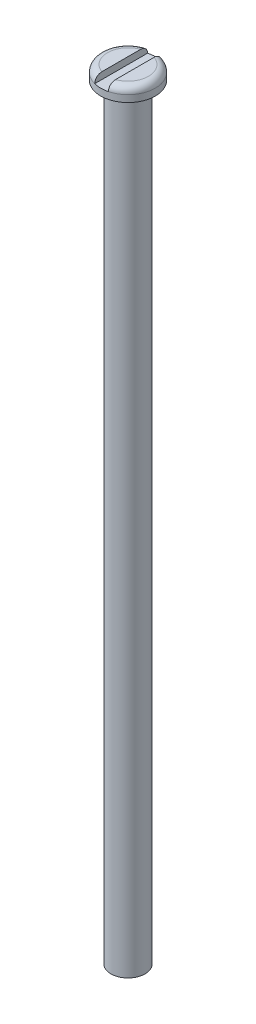
ISO-10303-21;
HEADER;
FILE_DESCRIPTION(('STEP AP214'),'2;1');
FILE_NAME('part.step','',(''),(''),'','','');
FILE_SCHEMA(('AUTOMOTIVE_DESIGN { 1 0 10303 214 1 1 1 1 }'));
ENDSEC;
DATA;
#1=APPLICATION_CONTEXT('core data for automotive mechanical design processes');
#2=APPLICATION_PROTOCOL_DEFINITION('international standard','automotive_design',2000,#1);
#3=PRODUCT_CONTEXT('',#1,'mechanical');
#4=PRODUCT('Part','Part','',(#3));
#5=PRODUCT_RELATED_PRODUCT_CATEGORY('part','',(#4));
#6=PRODUCT_DEFINITION_FORMATION('','',#4);
#7=PRODUCT_DEFINITION_CONTEXT('part definition',#1,'design');
#8=PRODUCT_DEFINITION('design','',#6,#7);
#9=PRODUCT_DEFINITION_SHAPE('','',#8);
#10=(LENGTH_UNIT() NAMED_UNIT(*) SI_UNIT(.MILLI.,.METRE.));
#11=(NAMED_UNIT(*) PLANE_ANGLE_UNIT() SI_UNIT($,.RADIAN.));
#12=(NAMED_UNIT(*) SI_UNIT($,.STERADIAN.) SOLID_ANGLE_UNIT());
#13=UNCERTAINTY_MEASURE_WITH_UNIT(LENGTH_MEASURE(1.E-05),#10,'distance_accuracy_value','');
#14=(GEOMETRIC_REPRESENTATION_CONTEXT(3) GLOBAL_UNCERTAINTY_ASSIGNED_CONTEXT((#13)) GLOBAL_UNIT_ASSIGNED_CONTEXT((#10,
#11,#12)) REPRESENTATION_CONTEXT('',''));
#15=CARTESIAN_POINT('',(0.,0.,0.));
#16=DIRECTION('',(0.,0.,1.));
#17=DIRECTION('',(1.,0.,0.));
#18=AXIS2_PLACEMENT_3D('',#15,#16,#17);
#19=CARTESIAN_POINT('',(0.,28.,0.));
#20=DIRECTION('',(0.,-1.,0.));
#21=DIRECTION('',(1.,0.,0.));
#22=AXIS2_PLACEMENT_3D('',#19,#20,#21);
#23=TOROIDAL_SURFACE('',#22,1.5,0.5);
#24=CARTESIAN_POINT('',(0.499999999999995,28.1372310223406,-1.91665451947094));
#25=CARTESIAN_POINT('',(0.499999999999995,28.1111030287091,-1.92436032075733));
#26=CARTESIAN_POINT('',(0.499999999999995,28.0843073274934,-1.92987362814176));
#27=CARTESIAN_POINT('',(0.499999999999995,28.0301483567895,-1.93632218137685));
#28=CARTESIAN_POINT('',(0.499999999999995,28.0027844659836,-1.93725211838577));
#29=CARTESIAN_POINT('',(0.499999999999995,27.9483010541632,-1.93449492886738));
#30=CARTESIAN_POINT('',(0.499999999999995,27.9211814237109,-1.93080998543376));
#31=CARTESIAN_POINT('',(0.499999999999995,27.8679522289656,-1.91894647377858));
#32=CARTESIAN_POINT('',(0.499999999999995,27.8418424337837,-1.91076893932324));
#33=CARTESIAN_POINT('',(0.499999999999995,27.7913041955103,-1.89016400943665));
#34=CARTESIAN_POINT('',(0.499999999999995,27.7668788857467,-1.8777289377535));
#35=CARTESIAN_POINT('',(0.499999999999995,27.7204150273195,-1.84900121197603));
#36=CARTESIAN_POINT('',(0.499999999999995,27.6983766855855,-1.83270822382299));
#37=CARTESIAN_POINT('',(0.499999999999995,27.6568847412822,-1.79644210983312));
#38=CARTESIAN_POINT('',(0.499999999999995,27.637483085636,-1.77640960398661));
#39=CARTESIAN_POINT('',(0.499999999999995,27.6021946414116,-1.73346022322838));
#40=CARTESIAN_POINT('',(0.499999999999995,27.5863082901203,-1.71054299002609));
#41=CARTESIAN_POINT('',(0.499999999999995,27.5579418179236,-1.66170188568055));
#42=CARTESIAN_POINT('',(0.499999999999995,27.5455871921618,-1.6357051900118));
#43=CARTESIAN_POINT('',(0.499999999999995,27.5252135651284,-1.58206792581925));
#44=CARTESIAN_POINT('',(0.499999999999995,27.5171953670182,-1.55442705382473));
#45=CARTESIAN_POINT('',(0.499999999999995,27.5053415150427,-1.49700293927695));
#46=CARTESIAN_POINT('',(0.499999999999995,27.501703890573,-1.46717885726814));
#47=CARTESIAN_POINT('',(0.499999999999995,27.4992421992746,-1.40733409548799));
#48=CARTESIAN_POINT('',(0.499999999999995,27.5004192819155,-1.37731337047799));
#49=CARTESIAN_POINT('',(0.499999999999995,27.5076329208896,-1.31640425916088));
#50=CARTESIAN_POINT('',(0.499999999999995,27.5138991078074,-1.28554300688512));
#51=CARTESIAN_POINT('',(0.499999999999995,27.5313488547117,-1.22523984294278));
#52=CARTESIAN_POINT('',(0.499999999999995,27.5425337056629,-1.19579830615081));
#53=CARTESIAN_POINT('',(0.499999999999995,27.5699767607518,-1.13816612578737));
#54=CARTESIAN_POINT('',(0.499999999999995,27.586391484798,-1.11004976955907));
#55=CARTESIAN_POINT('',(0.499999999999995,27.6237865493616,-1.05701373167176));
#56=CARTESIAN_POINT('',(0.499999999999995,27.644768083297,-1.03209488831107));
#57=CARTESIAN_POINT('',(0.499999999999995,27.6904370031974,-0.98678879896332));
#58=CARTESIAN_POINT('',(0.499999999999995,27.7150519547229,-0.966328931187963));
#59=CARTESIAN_POINT('',(0.499999999999995,27.767681679186,-0.930375773200786));
#60=CARTESIAN_POINT('',(0.499999999999995,27.7956932937045,-0.914877917106744));
#61=CARTESIAN_POINT('',(0.499999999999995,27.8513383681017,-0.891106681560979));
#62=CARTESIAN_POINT('',(0.499999999999995,27.8787277312908,-0.882264419340739));
#63=CARTESIAN_POINT('',(0.499999999999995,27.9346903948718,-0.87003427323492));
#64=CARTESIAN_POINT('',(0.499999999999995,27.9632623188285,-0.866640221434832));
#65=CARTESIAN_POINT('',(0.499999999999995,28.0170120562944,-0.865628474257113));
#66=CARTESIAN_POINT('',(0.499999999999995,28.0421796884719,-0.867357969378075));
#67=CARTESIAN_POINT('',(0.499999999999995,28.0918437182699,-0.875102569275719));
#68=CARTESIAN_POINT('',(0.499999999999995,28.116340099567,-0.881117778176436));
#69=CARTESIAN_POINT('',(0.499999999999995,28.1635991621832,-0.896950674656478));
#70=CARTESIAN_POINT('',(0.499999999999995,28.1863840384943,-0.906702858939272));
#71=CARTESIAN_POINT('',(0.499999999999995,28.2301969986554,-0.929562024296266));
#72=CARTESIAN_POINT('',(0.499999999999995,28.2512245651975,-0.942669988646086));
#73=CARTESIAN_POINT('',(0.499999999999995,28.2931106809172,-0.973179496401465));
#74=CARTESIAN_POINT('',(0.499999999999995,28.3137554609807,-0.990873988568376));
#75=CARTESIAN_POINT('',(0.499999999999995,28.3521765474984,-1.02914084315259));
#76=CARTESIAN_POINT('',(0.499999999999995,28.3699514599456,-1.04971459513559));
#77=CARTESIAN_POINT('',(0.499999999999995,28.4042835961954,-1.0957780233886));
#78=CARTESIAN_POINT('',(0.499999999999995,28.4204478269707,-1.12156132770368));
#79=CARTESIAN_POINT('',(0.499999999999995,28.4485319642397,-1.17534717522243));
#80=CARTESIAN_POINT('',(0.499999999999995,28.4604502990541,-1.20335053553219));
#81=CARTESIAN_POINT('',(0.499999999999995,28.4803883223137,-1.26275314354975));
#82=CARTESIAN_POINT('',(0.499999999999995,28.4881047229037,-1.29425483103533));
#83=CARTESIAN_POINT('',(0.499999999999995,28.4981246276801,-1.35811227879582));
#84=CARTESIAN_POINT('',(0.499999999999995,28.5004278642675,-1.39046808121382));
#85=CARTESIAN_POINT('',(0.499999999999995,28.4994431079835,-1.45499178732174));
#86=CARTESIAN_POINT('',(0.499999999999995,28.4961740875084,-1.4871599558984));
#87=CARTESIAN_POINT('',(0.499999999999995,28.4840368750671,-1.55042474589614));
#88=CARTESIAN_POINT('',(0.499999999999995,28.4751701154575,-1.58152163929046));
#89=CARTESIAN_POINT('',(0.499999999999995,28.4524692816474,-1.64033547604312));
#90=CARTESIAN_POINT('',(0.499999999999995,28.4388619288739,-1.66813984619569));
#91=CARTESIAN_POINT('',(0.499999999999995,28.4069342614986,-1.72091100337039));
#92=CARTESIAN_POINT('',(0.499999999999995,28.388613986008,-1.74587781393809));
#93=CARTESIAN_POINT('',(0.499999999999995,28.3487614820012,-1.79095515965259));
#94=CARTESIAN_POINT('',(0.499999999999995,28.327429849662,-1.81124333251702));
#95=CARTESIAN_POINT('',(0.499999999999995,28.2815592458641,-1.84774612883821));
#96=CARTESIAN_POINT('',(0.499999999999995,28.2570255373608,-1.86396731175743));
#97=CARTESIAN_POINT('',(0.499999999999995,28.2163211101127,-1.88594608635924));
#98=CARTESIAN_POINT('',(0.499999999999995,28.200959771928,-1.89323849355055));
#99=CARTESIAN_POINT('',(0.499999999999995,28.1695625322402,-1.90618970494275));
#100=CARTESIAN_POINT('',(0.499999999999995,28.1535266404202,-1.91184853258454));
#101=CARTESIAN_POINT('',(0.499999999999995,28.1372310223406,-1.91665451947094));
#102=B_SPLINE_CURVE_WITH_KNOTS('',3,(#24,#25,#26,#27,#28,#29,#30,#31,#32,#33,#34,#35,#36,#37,
#38,#39,#40,#41,#42,#43,#44,#45,#46,#47,#48,#49,#50,#51,#52,#53,#54,#55,#56,#57,#58,#59,#60,#61,
#62,#63,#64,#65,#66,#67,#68,#69,#70,#71,#72,#73,#74,#75,#76,#77,#78,#79,#80,#81,#82,#83,#84,#85,
#86,#87,#88,#89,#90,#91,#92,#93,#94,#95,#96,#97,#98,#99,#100,#101),.UNSPECIFIED.,.T.,.F.,(4,2,2,
2,2,2,2,2,2,2,2,2,2,2,2,2,2,2,2,2,2,2,2,2,2,2,2,2,2,2,2,2,2,2,2,2,2,2,4),(0.,0.0816598146833397,
0.163414192381001,0.245129910340836,0.326826833002296,0.408671836047236,0.490523928681237,
0.573807573052523,0.657101571692336,0.743065274013785,0.829044892453392,0.918780762726308,
1.00853805791329,1.10258645496875,1.19665955094276,1.2938648467062,1.3910955751315,
1.48659947353523,1.58201523808833,1.66785668359786,1.75360087936532,1.82890834620228,
1.90421764274255,1.97826317384213,2.052330425871,2.13357393390031,2.21485678711894,
2.30575813710544,2.39669310065417,2.49353083807835,2.59037336256196,2.68688681627475,
2.78337558400844,2.87577041095961,2.96816447117905,3.05604555840148,3.14378398099421,
3.19471465203011,3.2456445922048),.UNSPECIFIED.);
#103=CARTESIAN_POINT('',(0.499999999999995,28.5,-1.4142135623731));
#104=VERTEX_POINT('',#103);
#105=CARTESIAN_POINT('',(0.499999999999995,28.,-1.93649167310371));
#106=VERTEX_POINT('',#105);
#107=EDGE_CURVE('E88',#104,#106,#102,.T.);
#108=ORIENTED_EDGE('',*,*,#107,.F.);
#109=CARTESIAN_POINT('',(0.,28.5,0.));
#110=DIRECTION('',(0.,-1.,0.));
#111=DIRECTION('',(1.,0.,0.));
#112=AXIS2_PLACEMENT_3D('',#109,#110,#111);
#113=CIRCLE('',#112,1.5);
#114=CARTESIAN_POINT('',(0.499999999999995,28.5,1.4142135623731));
#115=VERTEX_POINT('',#114);
#116=EDGE_CURVE('E94',#104,#115,#113,.T.);
#117=ORIENTED_EDGE('',*,*,#116,.T.);
#118=CARTESIAN_POINT('',(0.499999999999995,28.1224919896329,0.883575136613813));
#119=CARTESIAN_POINT('',(0.499999999999995,28.0987303931295,0.876677411064469));
#120=CARTESIAN_POINT('',(0.499999999999995,28.0743898987017,0.871735096427479));
#121=CARTESIAN_POINT('',(0.499999999999995,28.0252153959676,0.866055634327228));
#122=CARTESIAN_POINT('',(0.499999999999995,28.0003812863677,0.865319359106039));
#123=CARTESIAN_POINT('',(0.499999999999995,27.9509628547997,0.868098938224834));
#124=CARTESIAN_POINT('',(0.499999999999995,27.926378448902,0.871613312709289));
#125=CARTESIAN_POINT('',(0.499999999999995,27.878140141063,0.882679301416792));
#126=CARTESIAN_POINT('',(0.499999999999995,27.8544864564044,0.890231852443535));
#127=CARTESIAN_POINT('',(0.499999999999995,27.8084170492379,0.909086115754863));
#128=CARTESIAN_POINT('',(0.499999999999995,27.7860187266466,0.920430015077866));
#129=CARTESIAN_POINT('',(0.499999999999995,27.7431890921763,0.946355961560683));
#130=CARTESIAN_POINT('',(0.499999999999995,27.7227584257207,0.9609390660815));
#131=CARTESIAN_POINT('',(0.499999999999995,27.6820675772419,0.994609103590451));
#132=CARTESIAN_POINT('',(0.499999999999995,27.6620709590821,1.01401433013659));
#133=CARTESIAN_POINT('',(0.499999999999995,27.6252136261326,1.05560324616767));
#134=CARTESIAN_POINT('',(0.499999999999995,27.6083544493222,1.07778828945429));
#135=CARTESIAN_POINT('',(0.499999999999995,27.576346273635,1.12698254192573));
#136=CARTESIAN_POINT('',(0.499999999999995,27.5615987572825,1.1542538075449));
#137=CARTESIAN_POINT('',(0.499999999999995,27.5366343353669,1.21080018030676));
#138=CARTESIAN_POINT('',(0.499999999999995,27.5264188406612,1.24007590818634));
#139=CARTESIAN_POINT('',(0.499999999999995,27.5104057072038,1.30138641194105));
#140=CARTESIAN_POINT('',(0.499999999999995,27.5048541877588,1.33348596047433));
#141=CARTESIAN_POINT('',(0.499999999999995,27.4993005343658,1.39816622305223));
#142=CARTESIAN_POINT('',(0.499999999999995,27.4992982968328,1.43074692810406));
#143=CARTESIAN_POINT('',(0.499999999999995,27.5049310314524,1.49494778264042));
#144=CARTESIAN_POINT('',(0.499999999999995,27.510484301934,1.52657500998176));
#145=CARTESIAN_POINT('',(0.499999999999995,27.527081424127,1.58835819478915));
#146=CARTESIAN_POINT('',(0.499999999999995,27.5381239311782,1.61851451058851));
#147=CARTESIAN_POINT('',(0.499999999999995,27.5648535477049,1.67500567270412));
#148=CARTESIAN_POINT('',(0.499999999999995,27.5803040327565,1.70145242295631));
#149=CARTESIAN_POINT('',(0.499999999999995,27.6156386681566,1.75119913021605));
#150=CARTESIAN_POINT('',(0.499999999999995,27.6355215377573,1.7744999931185));
#151=CARTESIAN_POINT('',(0.499999999999995,27.6781100681977,1.81610346713436));
#152=CARTESIAN_POINT('',(0.499999999999995,27.7006332268706,1.83459300610749));
#153=CARTESIAN_POINT('',(0.499999999999995,27.7485626639963,1.86735541861617));
#154=CARTESIAN_POINT('',(0.499999999999995,27.7739682800905,1.88162925816993));
#155=CARTESIAN_POINT('',(0.499999999999995,27.8259278974374,1.90502369229291));
#156=CARTESIAN_POINT('',(0.499999999999995,27.8524054297903,1.91431432811617));
#157=CARTESIAN_POINT('',(0.499999999999995,27.9065620897995,1.928211617263));
#158=CARTESIAN_POINT('',(0.499999999999995,27.9342410481127,1.93281892848871));
#159=CARTESIAN_POINT('',(0.499999999999995,27.9893935488854,1.9371486498561));
#160=CARTESIAN_POINT('',(0.499999999999995,28.0168592756722,1.93697123268119));
#161=CARTESIAN_POINT('',(0.499999999999995,28.0713657582182,1.9319846674338));
#162=CARTESIAN_POINT('',(0.499999999999995,28.0984065362462,1.92717576289613));
#163=CARTESIAN_POINT('',(0.499999999999995,28.1511761532345,1.91311452262224));
#164=CARTESIAN_POINT('',(0.499999999999995,28.1769102804398,1.90388199506377));
#165=CARTESIAN_POINT('',(0.499999999999995,28.2264879507849,1.88127546140193));
#166=CARTESIAN_POINT('',(0.499999999999995,28.2503314402032,1.86790133767024));
#167=CARTESIAN_POINT('',(0.499999999999995,28.2957627294643,1.83724702398013));
#168=CARTESIAN_POINT('',(0.499999999999995,28.3173210610862,1.81992320319197));
#169=CARTESIAN_POINT('',(0.499999999999995,28.3573158037485,1.78198792739617));
#170=CARTESIAN_POINT('',(0.499999999999995,28.3757519069765,1.76137614862573));
#171=CARTESIAN_POINT('',(0.499999999999995,28.4095226302009,1.71687531577245));
#172=CARTESIAN_POINT('',(0.499999999999995,28.4247610587677,1.69291332520379));
#173=CARTESIAN_POINT('',(0.499999999999995,28.4511743480846,1.64284859312565));
#174=CARTESIAN_POINT('',(0.499999999999995,28.4623485316293,1.61674549574107));
#175=CARTESIAN_POINT('',(0.499999999999995,28.4808026562962,1.56203754007973));
#176=CARTESIAN_POINT('',(0.499999999999995,28.4879098141742,1.53337445192267));
#177=CARTESIAN_POINT('',(0.499999999999995,28.4974492851418,1.47528274033668));
#178=CARTESIAN_POINT('',(0.499999999999995,28.4998805578692,1.44585394801811));
#179=CARTESIAN_POINT('',(0.499999999999995,28.5001163052263,1.38557476617824));
#180=CARTESIAN_POINT('',(0.499999999999995,28.4976947003189,1.35472348258262));
#181=CARTESIAN_POINT('',(0.499999999999995,28.4879266519966,1.29381121958623));
#182=CARTESIAN_POINT('',(0.499999999999995,28.4805791763709,1.26375040720021));
#183=CARTESIAN_POINT('',(0.499999999999995,28.4607895541768,1.2039482632493));
#184=CARTESIAN_POINT('',(0.499999999999995,28.4481467112772,1.174273174727));
#185=CARTESIAN_POINT('',(0.499999999999995,28.4180921574932,1.11741827653465));
#186=CARTESIAN_POINT('',(0.499999999999995,28.4006775830868,1.09023997831015));
#187=CARTESIAN_POINT('',(0.499999999999995,28.3613199611298,1.03905099791998));
#188=CARTESIAN_POINT('',(0.499999999999995,28.3393440614349,1.01506549123719));
#189=CARTESIAN_POINT('',(0.499999999999995,28.2914341482557,0.971474154978753));
#190=CARTESIAN_POINT('',(0.499999999999995,28.2655074849609,0.95186035559061));
#191=CARTESIAN_POINT('',(0.499999999999995,28.2199332574621,0.923893510702201));
#192=CARTESIAN_POINT('',(0.499999999999995,28.2012229879933,0.913993528580006));
#193=CARTESIAN_POINT('',(0.499999999999995,28.1626462238625,0.896779481182967));
#194=CARTESIAN_POINT('',(0.499999999999995,28.1427801175615,0.889464553107431));
#195=CARTESIAN_POINT('',(0.499999999999995,28.1224919896329,0.883575136613813));
#196=B_SPLINE_CURVE_WITH_KNOTS('',3,(#118,#119,#120,#121,#122,#123,#124,#125,#126,#127,#128,
#129,#130,#131,#132,#133,#134,#135,#136,#137,#138,#139,#140,#141,#142,#143,#144,#145,#146,#147,
#148,#149,#150,#151,#152,#153,#154,#155,#156,#157,#158,#159,#160,#161,#162,#163,#164,#165,#166,
#167,#168,#169,#170,#171,#172,#173,#174,#175,#176,#177,#178,#179,#180,#181,#182,#183,#184,#185,
#186,#187,#188,#189,#190,#191,#192,#193,#194,#195),.UNSPECIFIED.,.T.,.F.,(4,2,2,2,2,2,2,2,2,2,2,
2,2,2,2,2,2,2,2,2,2,2,2,2,2,2,2,2,2,2,2,2,2,2,2,2,2,2,4),(0.,0.074154278020796,
0.148323933485177,0.222467774357524,0.296628823090705,0.371644186419793,0.446684072798841,
0.529939647604048,0.61323592755174,0.705838007329161,0.798468894736995,0.895726008828229,
0.99298130747973,1.08882704952962,1.18464932447517,1.27607043239229,1.3674651581301,
1.45444981991424,1.54141453386282,1.62518462492976,1.70894294654954,1.790949098956,
1.87295093951597,1.95458897445377,2.03622932826216,2.11881943694544,2.20141768324187,
2.2862261311035,2.37104870372143,2.45924884670791,2.54746861153787,2.6398937249925,
2.73233821208656,2.82865878420412,2.9250372854895,3.02213564834763,3.11905552190526,
3.18239109177394,3.24570550243348),.UNSPECIFIED.);
#197=CARTESIAN_POINT('',(0.499999999999995,28.,1.93649167310371));
#198=VERTEX_POINT('',#197);
#199=EDGE_CURVE('E87',#198,#115,#196,.T.);
#200=ORIENTED_EDGE('',*,*,#199,.F.);
#201=CARTESIAN_POINT('',(0.,28.,0.));
#202=DIRECTION('',(0.,-1.,0.));
#203=DIRECTION('',(1.,0.,0.));
#204=AXIS2_PLACEMENT_3D('',#201,#202,#203);
#205=CIRCLE('',#204,2.);
#206=EDGE_CURVE('E84',#106,#198,#205,.T.);
#207=ORIENTED_EDGE('',*,*,#206,.F.);
#208=EDGE_LOOP('',(#108,#117,#200,#207));
#209=FACE_BOUND('',#208,.T.);
#210=ADVANCED_FACE('F34',(#209),#23,.T.);
#211=CARTESIAN_POINT('',(1.5,28.5,0.));
#212=DIRECTION('',(0.,1.,0.));
#213=DIRECTION('',(-1.,0.,0.));
#214=AXIS2_PLACEMENT_3D('',#211,#212,#213);
#215=PLANE('',#214);
#216=DIRECTION('',(0.,0.,-1.));
#217=VECTOR('',#216,1.);
#218=CARTESIAN_POINT('',(0.499999999999995,28.5,0.));
#219=LINE('',#218,#217);
#220=EDGE_CURVE('E11',#115,#104,#219,.T.);
#221=ORIENTED_EDGE('',*,*,#220,.F.);
#222=ORIENTED_EDGE('',*,*,#116,.F.);
#223=EDGE_LOOP('',(#221,#222));
#224=FACE_BOUND('',#223,.T.);
#225=ADVANCED_FACE('F128',(#224),#215,.T.);
#226=CARTESIAN_POINT('',(-0.500000000000005,28.1372310223406,-1.91665451947094));
#227=CARTESIAN_POINT('',(-0.500000000000005,28.1639075186201,-1.90878408799303));
#228=CARTESIAN_POINT('',(-0.500000000000005,28.1899315138432,-1.89861468774866));
#229=CARTESIAN_POINT('',(-0.500000000000005,28.2399061948691,-1.87400728656625));
#230=CARTESIAN_POINT('',(-0.500000000000005,28.2638537077936,-1.85956289701931));
#231=CARTESIAN_POINT('',(-0.500000000000005,28.3089589350289,-1.82689931747279));
#232=CARTESIAN_POINT('',(-0.500000000000005,28.3301210948364,-1.80868626487721));
#233=CARTESIAN_POINT('',(-0.500000000000005,28.3691553389772,-1.76903935873199));
#234=CARTESIAN_POINT('',(-0.500000000000005,28.3870282704339,-1.74760633705842));
#235=CARTESIAN_POINT('',(-0.500000000000005,28.419421626422,-1.7016624423007));
#236=CARTESIAN_POINT('',(-0.500000000000005,28.4338634721782,-1.67709623033583));
#237=CARTESIAN_POINT('',(-0.500000000000005,28.4586031219643,-1.62596058160794));
#238=CARTESIAN_POINT('',(-0.500000000000005,28.4689000562135,-1.59939072578172));
#239=CARTESIAN_POINT('',(-0.500000000000005,28.4855186582935,-1.54384398988716));
#240=CARTESIAN_POINT('',(-0.500000000000005,28.4916594962777,-1.51481306075414));
#241=CARTESIAN_POINT('',(-0.500000000000005,28.4992215852724,-1.45614479158434));
#242=CARTESIAN_POINT('',(-0.500000000000005,28.5006417577134,-1.42650731452065));
#243=CARTESIAN_POINT('',(-0.500000000000005,28.498785005953,-1.36595813864672));
#244=CARTESIAN_POINT('',(-0.500000000000005,28.4952797943379,-1.33505341745399));
#245=CARTESIAN_POINT('',(-0.500000000000005,28.4833406907206,-1.27421002770104));
#246=CARTESIAN_POINT('',(-0.500000000000005,28.4749055906657,-1.24427159782541));
#247=CARTESIAN_POINT('',(-0.500000000000005,28.4529285133586,-1.1849578758062));
#248=CARTESIAN_POINT('',(-0.500000000000005,28.4391955580386,-1.15565314364886));
#249=CARTESIAN_POINT('',(-0.500000000000005,28.4070116707679,-1.09974253324702));
#250=CARTESIAN_POINT('',(-0.500000000000005,28.3885592258725,-1.07313752429042));
#251=CARTESIAN_POINT('',(-0.500000000000005,28.3473239620784,-1.02348472955939));
#252=CARTESIAN_POINT('',(-0.500000000000005,28.3245388856892,-1.00043880962075));
#253=CARTESIAN_POINT('',(-0.500000000000005,28.2751376756609,-0.958880755162935));
#254=CARTESIAN_POINT('',(-0.500000000000005,28.2485234534087,-0.940366371027869));
#255=CARTESIAN_POINT('',(-0.500000000000005,28.1943761768548,-0.910146731992964));
#256=CARTESIAN_POINT('',(-0.500000000000005,28.1670790095352,-0.898021238234886));
#257=CARTESIAN_POINT('',(-0.500000000000005,28.1106554188415,-0.879312780780958));
#258=CARTESIAN_POINT('',(-0.500000000000005,28.0815315574728,-0.872722233005708));
#259=CARTESIAN_POINT('',(-0.500000000000005,28.0263669826589,-0.866058290539931));
#260=CARTESIAN_POINT('',(-0.500000000000005,28.0004130069904,-0.865254059023725));
#261=CARTESIAN_POINT('',(-0.500000000000005,27.9487808763572,-0.868287843871665));
#262=CARTESIAN_POINT('',(-0.500000000000005,27.9231026702999,-0.872124984807503));
#263=CARTESIAN_POINT('',(-0.500000000000005,27.8741557302496,-0.883864370992519));
#264=CARTESIAN_POINT('',(-0.500000000000005,27.8508315104618,-0.891539180617262));
#265=CARTESIAN_POINT('',(-0.500000000000005,27.8056698540471,-0.910429085711211));
#266=CARTESIAN_POINT('',(-0.500000000000005,27.7838327742758,-0.921645027300149));
#267=CARTESIAN_POINT('',(-0.500000000000005,27.7405092310575,-0.948103726511744));
#268=CARTESIAN_POINT('',(-0.500000000000005,27.7191673815376,-0.963582446138179));
#269=CARTESIAN_POINT('',(-0.500000000000005,27.6790224855575,-0.997536976983995));
#270=CARTESIAN_POINT('',(-0.500000000000005,27.660220597354,-1.01601414713999));
#271=CARTESIAN_POINT('',(-0.500000000000005,27.6233083649324,-1.05785645070952));
#272=CARTESIAN_POINT('',(-0.500000000000005,27.6055616716657,-1.08154286061392));
#273=CARTESIAN_POINT('',(-0.500000000000005,27.5739276913128,-1.13136806113855));
#274=CARTESIAN_POINT('',(-0.500000000000005,27.5600420682046,-1.15750790262591));
#275=CARTESIAN_POINT('',(-0.500000000000005,27.5354210216069,-1.21386517318292));
#276=CARTESIAN_POINT('',(-0.500000000000005,27.525045889337,-1.24424080422941));
#277=CARTESIAN_POINT('',(-0.500000000000005,27.5094621503982,-1.30629406383179));
#278=CARTESIAN_POINT('',(-0.500000000000005,27.5042542617267,-1.33797187269086));
#279=CARTESIAN_POINT('',(-0.500000000000005,27.4992024339963,-1.40218263096157));
#280=CARTESIAN_POINT('',(-0.500000000000005,27.4994303973712,-1.43472134930283));
#281=CARTESIAN_POINT('',(-0.500000000000005,27.5055542921375,-1.49926538872608));
#282=CARTESIAN_POINT('',(-0.500000000000005,27.5114493285145,-1.53127079322361));
#283=CARTESIAN_POINT('',(-0.500000000000005,27.5285600769234,-1.59260910742592));
#284=CARTESIAN_POINT('',(-0.500000000000005,27.5395799539295,-1.62199652232338));
#285=CARTESIAN_POINT('',(-0.500000000000005,27.5666508257163,-1.67835790205194));
#286=CARTESIAN_POINT('',(-0.500000000000005,27.5827003835411,-1.70533255337232));
#287=CARTESIAN_POINT('',(-0.500000000000005,27.6185090194449,-1.75466775962757));
#288=CARTESIAN_POINT('',(-0.500000000000005,27.6380439085721,-1.77719107158849));
#289=CARTESIAN_POINT('',(-0.500000000000005,27.6807698380871,-1.81845160507657));
#290=CARTESIAN_POINT('',(-0.500000000000005,27.7039597440132,-1.83718999728149));
#291=CARTESIAN_POINT('',(-0.500000000000005,27.7522438265737,-1.8695060618389));
#292=CARTESIAN_POINT('',(-0.500000000000005,27.7772120856364,-1.88327204658304));
#293=CARTESIAN_POINT('',(-0.500000000000005,27.8291630853294,-1.90627760292927));
#294=CARTESIAN_POINT('',(-0.500000000000005,27.8561460408139,-1.915516690971));
#295=CARTESIAN_POINT('',(-0.500000000000005,27.910528073205,-1.92895376152128));
#296=CARTESIAN_POINT('',(-0.500000000000005,27.9378940569429,-1.93328632393144));
#297=CARTESIAN_POINT('',(-0.500000000000005,27.9929371918467,-1.93722340317523));
#298=CARTESIAN_POINT('',(-0.500000000000005,28.0206138192649,-1.9368349474099));
#299=CARTESIAN_POINT('',(-0.500000000000005,28.0631326751473,-1.93259887050628));
#300=CARTESIAN_POINT('',(-0.500000000000005,28.0781550902528,-1.93038362154205));
#301=CARTESIAN_POINT('',(-0.500000000000005,28.1079267562093,-1.92455853472385));
#302=CARTESIAN_POINT('',(-0.500000000000005,28.1226760115198,-1.92094871965841));
#303=CARTESIAN_POINT('',(-0.500000000000005,28.1372310223406,-1.91665451947094));
#304=B_SPLINE_CURVE_WITH_KNOTS('',3,(#226,#227,#228,#229,#230,#231,#232,#233,#234,#235,#236,
#237,#238,#239,#240,#241,#242,#243,#244,#245,#246,#247,#248,#249,#250,#251,#252,#253,#254,#255,
#256,#257,#258,#259,#260,#261,#262,#263,#264,#265,#266,#267,#268,#269,#270,#271,#272,#273,#274,
#275,#276,#277,#278,#279,#280,#281,#282,#283,#284,#285,#286,#287,#288,#289,#290,#291,#292,#293,
#294,#295,#296,#297,#298,#299,#300,#301,#302,#303),.UNSPECIFIED.,.T.,.F.,(4,2,2,2,2,2,2,2,2,2,2,
2,2,2,2,2,2,2,2,2,2,2,2,2,2,2,2,2,2,2,2,2,2,2,2,2,2,2,4),(0.,0.0833825864707535,
0.166890415807108,0.250263305110134,0.333614692025946,0.418722431880648,0.503848021699349,
0.592473203865682,0.681118633569822,0.774010876806517,0.866925892526381,0.963561684056811,
1.06022849340744,1.15694580909871,1.25361501303576,1.34270032871139,1.43166337805174,
1.50915393601254,1.58662988043994,1.6599787005286,1.7333450598994,1.81212183353878,
1.89093441005789,1.97935368708442,2.06781101068734,2.1636615634277,2.25952543290399,
2.35665803141399,2.45377529206052,2.54745298224641,2.6411039335232,2.73009722086027,
2.81906294023227,2.90417680488754,2.9892997593734,3.07202661486921,3.154630343642,
3.20012560910135,3.24562013115642),.UNSPECIFIED.);
#305=CARTESIAN_POINT('',(-0.500000000000005,28.,-1.93649167310371));
#306=VERTEX_POINT('',#305);
#307=CARTESIAN_POINT('',(-0.500000000000005,28.5,-1.4142135623731));
#308=VERTEX_POINT('',#307);
#309=EDGE_CURVE('E95',#306,#308,#304,.T.);
#310=ORIENTED_EDGE('',*,*,#309,.F.);
#311=CARTESIAN_POINT('',(-0.500000000000005,28.,1.93649167310371));
#312=VERTEX_POINT('',#311);
#313=EDGE_CURVE('E82',#312,#306,#205,.T.);
#314=ORIENTED_EDGE('',*,*,#313,.F.);
#315=CARTESIAN_POINT('',(-0.500000000000005,28.1224919896329,0.883575136613811));
#316=CARTESIAN_POINT('',(-0.500000000000005,28.14931021188,0.891363381312541));
#317=CARTESIAN_POINT('',(-0.500000000000005,28.1754359832527,0.901658295720112));
#318=CARTESIAN_POINT('',(-0.500000000000005,28.2255349599201,0.926640812629033));
#319=CARTESIAN_POINT('',(-0.500000000000005,28.2495021346875,0.941340253543704));
#320=CARTESIAN_POINT('',(-0.500000000000005,28.2945932867452,0.974337182110797));
#321=CARTESIAN_POINT('',(-0.500000000000005,28.3157326384213,0.992613761162935));
#322=CARTESIAN_POINT('',(-0.500000000000005,28.3549530240358,1.032165380658));
#323=CARTESIAN_POINT('',(-0.500000000000005,28.3730352059328,1.05343929008609));
#324=CARTESIAN_POINT('',(-0.500000000000005,28.4073711000541,1.10046622168226));
#325=CARTESIAN_POINT('',(-0.500000000000005,28.4233081472259,1.12645073716118));
#326=CARTESIAN_POINT('',(-0.500000000000005,28.450906360229,1.1806057402772));
#327=CARTESIAN_POINT('',(-0.500000000000005,28.4625656228722,1.20877719414742));
#328=CARTESIAN_POINT('',(-0.500000000000005,28.4819254793694,1.26845691020674));
#329=CARTESIAN_POINT('',(-0.500000000000005,28.4893253399983,1.3000633563796));
#330=CARTESIAN_POINT('',(-0.500000000000005,28.498688595945,1.36407632238366));
#331=CARTESIAN_POINT('',(-0.500000000000005,28.5006517589792,1.39648287633989));
#332=CARTESIAN_POINT('',(-0.500000000000005,28.498972819759,1.46098931427997));
#333=CARTESIAN_POINT('',(-0.500000000000005,28.4953597497211,1.49308991700791));
#334=CARTESIAN_POINT('',(-0.500000000000005,28.4825477457184,1.55616008570421));
#335=CARTESIAN_POINT('',(-0.500000000000005,28.4733500797836,1.58712990673437));
#336=CARTESIAN_POINT('',(-0.500000000000005,28.4500314958421,1.64562161216011));
#337=CARTESIAN_POINT('',(-0.500000000000005,28.4361389352672,1.67323444661103));
#338=CARTESIAN_POINT('',(-0.500000000000005,28.4036846351727,1.72556725508066));
#339=CARTESIAN_POINT('',(-0.500000000000005,28.3851242399287,1.75028805896856));
#340=CARTESIAN_POINT('',(-0.500000000000005,28.3448571761383,1.79484111413791));
#341=CARTESIAN_POINT('',(-0.500000000000005,28.3233504368723,1.8148541430369));
#342=CARTESIAN_POINT('',(-0.500000000000005,28.2771644197447,1.85080589298941));
#343=CARTESIAN_POINT('',(-0.500000000000005,28.2524859188428,1.86674560899975));
#344=CARTESIAN_POINT('',(-0.500000000000005,28.2017101413406,1.89345678605642));
#345=CARTESIAN_POINT('',(-0.500000000000005,28.1757065504072,1.90440652157567));
#346=CARTESIAN_POINT('',(-0.500000000000005,28.1222023345921,1.92166406786806));
#347=CARTESIAN_POINT('',(-0.500000000000005,28.0947019441672,1.92797260339871));
#348=CARTESIAN_POINT('',(-0.500000000000005,28.0396891941437,1.93564111473844));
#349=CARTESIAN_POINT('',(-0.500000000000005,28.0121926995517,1.93711530278117));
#350=CARTESIAN_POINT('',(-0.500000000000005,27.9573479559747,1.93538883119258));
#351=CARTESIAN_POINT('',(-0.500000000000005,27.92999969711,1.93218848705103));
#352=CARTESIAN_POINT('',(-0.500000000000005,27.8764345184452,1.92125883127926));
#353=CARTESIAN_POINT('',(-0.500000000000005,27.8502107826116,1.9135628432784));
#354=CARTESIAN_POINT('',(-0.500000000000005,27.7994114279618,1.89391481998153));
#355=CARTESIAN_POINT('',(-0.500000000000005,27.7748358328883,1.88196272338877));
#356=CARTESIAN_POINT('',(-0.500000000000005,27.7277831457281,1.85405194202864));
#357=CARTESIAN_POINT('',(-0.500000000000005,27.7053265747806,1.83805869828043));
#358=CARTESIAN_POINT('',(-0.500000000000005,27.6633384772787,1.80261127051311));
#359=CARTESIAN_POINT('',(-0.500000000000005,27.6438072078758,1.78315678255852));
#360=CARTESIAN_POINT('',(-0.500000000000005,27.607702250029,1.74085187694683));
#361=CARTESIAN_POINT('',(-0.500000000000005,27.5912115809325,1.71793066634099));
#362=CARTESIAN_POINT('',(-0.500000000000005,27.5621512628536,1.66972766998416));
#363=CARTESIAN_POINT('',(-0.500000000000005,27.5495822142753,1.64444552354066));
#364=CARTESIAN_POINT('',(-0.500000000000005,27.5282018941582,1.59122739928632));
#365=CARTESIAN_POINT('',(-0.500000000000005,27.5195504906372,1.56322725212324));
#366=CARTESIAN_POINT('',(-0.500000000000005,27.5068404262384,1.50620564376061));
#367=CARTESIAN_POINT('',(-0.500000000000005,27.5027827450851,1.47718396605481));
#368=CARTESIAN_POINT('',(-0.500000000000005,27.4991741286425,1.41749521772457));
#369=CARTESIAN_POINT('',(-0.500000000000005,27.499843563666,1.3868148318736));
#370=CARTESIAN_POINT('',(-0.500000000000005,27.5060908887352,1.32595813491568));
#371=CARTESIAN_POINT('',(-0.500000000000005,27.5116699829878,1.29578194932585));
#372=CARTESIAN_POINT('',(-0.500000000000005,27.527884045193,1.2353698697715));
#373=CARTESIAN_POINT('',(-0.500000000000005,27.5387335197058,1.20519140294171));
#374=CARTESIAN_POINT('',(-0.500000000000005,27.5652602582184,1.14702539691342));
#375=CARTESIAN_POINT('',(-0.500000000000005,27.5809390241349,1.11903854271057));
#376=CARTESIAN_POINT('',(-0.500000000000005,27.6170570774991,1.06565274922897));
#377=CARTESIAN_POINT('',(-0.500000000000005,27.6375688163953,1.04030262424596));
#378=CARTESIAN_POINT('',(-0.500000000000005,27.6827748511454,0.993630300699353));
#379=CARTESIAN_POINT('',(-0.500000000000005,27.7074685339561,0.972307512724633));
#380=CARTESIAN_POINT('',(-0.500000000000005,27.7590269703132,0.935723541011622));
#381=CARTESIAN_POINT('',(-0.500000000000005,27.7857024527594,0.920197187306004));
#382=CARTESIAN_POINT('',(-0.500000000000005,27.8415570900123,0.894589493846832));
#383=CARTESIAN_POINT('',(-0.500000000000005,27.8707335900307,0.884502461299384));
#384=CARTESIAN_POINT('',(-0.500000000000005,27.9268031787952,0.871413399972248));
#385=CARTESIAN_POINT('',(-0.500000000000005,27.9535277928068,0.867685166067045));
#386=CARTESIAN_POINT('',(-0.500000000000005,28.0071734690765,0.865257576144349));
#387=CARTESIAN_POINT('',(-0.500000000000005,28.0340939960629,0.866547596863849));
#388=CARTESIAN_POINT('',(-0.500000000000005,28.0710856360472,0.871755079017904));
#389=CARTESIAN_POINT('',(-0.500000000000005,28.0814828359581,0.873606975426929));
#390=CARTESIAN_POINT('',(-0.500000000000005,28.102116979381,0.878045009195266));
#391=CARTESIAN_POINT('',(-0.500000000000005,28.1123539618032,0.880630965267478));
#392=CARTESIAN_POINT('',(-0.500000000000005,28.1224919896329,0.883575136613811));
#393=B_SPLINE_CURVE_WITH_KNOTS('',3,(#315,#316,#317,#318,#319,#320,#321,#322,#323,#324,#325,
#326,#327,#328,#329,#330,#331,#332,#333,#334,#335,#336,#337,#338,#339,#340,#341,#342,#343,#344,
#345,#346,#347,#348,#349,#350,#351,#352,#353,#354,#355,#356,#357,#358,#359,#360,#361,#362,#363,
#364,#365,#366,#367,#368,#369,#370,#371,#372,#373,#374,#375,#376,#377,#378,#379,#380,#381,#382,
#383,#384,#385,#386,#387,#388,#389,#390,#391,#392),.UNSPECIFIED.,.T.,.F.,(4,2,2,2,2,2,2,2,2,2,2,
2,2,2,2,2,2,2,2,2,2,2,2,2,2,2,2,2,2,2,2,2,2,2,2,2,2,2,4),(0.,0.0837344221532104,
0.167695954489599,0.251180642064091,0.334633911417859,0.425690158702655,0.516786867966425,
0.613707450025559,0.710632172965943,0.807053964723045,0.903453871275829,0.995714468254783,
1.08794852574689,1.17564087321477,1.26331178022846,1.34754212800017,1.43175931979009,
1.51397196270031,1.59617905723717,1.67778439395167,1.75939090599905,1.84172042689269,
1.92405718079957,2.00838664438573,2.09272901256837,2.18025710156122,2.26780385456298,
2.35945795849939,2.4511345489782,2.54690217416188,2.64269961333955,2.7400364910088,
2.83735911211835,2.92942577859249,3.02139590014218,3.10190621358163,3.18224618566038,
3.21390791972159,3.245561841233),.UNSPECIFIED.);
#394=CARTESIAN_POINT('',(-0.500000000000005,28.5,1.4142135623731));
#395=VERTEX_POINT('',#394);
#396=EDGE_CURVE('E123',#395,#312,#393,.T.);
#397=ORIENTED_EDGE('',*,*,#396,.F.);
#398=EDGE_CURVE('E114',#395,#308,#113,.T.);
#399=ORIENTED_EDGE('',*,*,#398,.T.);
#400=EDGE_LOOP('',(#310,#314,#397,#399));
#401=FACE_BOUND('',#400,.T.);
#402=ADVANCED_FACE('F36',(#401),#23,.T.);
#403=DIRECTION('',(0.,0.,1.));
#404=VECTOR('',#403,1.);
#405=CARTESIAN_POINT('',(-0.500000000000005,28.5,0.));
#406=LINE('',#405,#404);
#407=EDGE_CURVE('E43',#308,#395,#406,.T.);
#408=ORIENTED_EDGE('',*,*,#407,.F.);
#409=ORIENTED_EDGE('',*,*,#398,.F.);
#410=EDGE_LOOP('',(#408,#409));
#411=FACE_BOUND('',#410,.T.);
#412=ADVANCED_FACE('F125',(#411),#215,.T.);
#413=CARTESIAN_POINT('',(0.,-28.5,0.));
#414=DIRECTION('',(0.,-1.,0.));
#415=DIRECTION('',(1.,0.,0.));
#416=AXIS2_PLACEMENT_3D('',#413,#414,#415);
#417=PLANE('',#416);
#418=CARTESIAN_POINT('',(0.,-28.5,0.));
#419=DIRECTION('',(0.,-1.,0.));
#420=DIRECTION('',(1.,0.,0.));
#421=AXIS2_PLACEMENT_3D('',#418,#419,#420);
#422=CIRCLE('',#421,1.24999999999999);
#423=CARTESIAN_POINT('',(1.25,-28.5,0.));
#424=VERTEX_POINT('',#423);
#425=EDGE_CURVE('E111',#424,#424,#422,.T.);
#426=ORIENTED_EDGE('',*,*,#425,.T.);
#427=EDGE_LOOP('',(#426));
#428=FACE_BOUND('',#427,.T.);
#429=ADVANCED_FACE('F127',(#428),#417,.T.);
#430=CARTESIAN_POINT('',(0.,-28.5,0.));
#431=DIRECTION('',(0.,-1.,0.));
#432=DIRECTION('',(1.,0.,0.));
#433=AXIS2_PLACEMENT_3D('',#430,#431,#432);
#434=CYLINDRICAL_SURFACE('',#433,1.25);
#435=CARTESIAN_POINT('',(0.,27.5,0.));
#436=DIRECTION('',(0.,-1.,0.));
#437=DIRECTION('',(1.,0.,0.));
#438=AXIS2_PLACEMENT_3D('',#435,#436,#437);
#439=CIRCLE('',#438,1.25);
#440=CARTESIAN_POINT('',(1.25,27.5,0.));
#441=VERTEX_POINT('',#440);
#442=EDGE_CURVE('E108',#441,#441,#439,.T.);
#443=ORIENTED_EDGE('',*,*,#442,.T.);
#444=EDGE_LOOP('',(#443));
#445=FACE_BOUND('',#444,.T.);
#446=ORIENTED_EDGE('',*,*,#425,.F.);
#447=EDGE_LOOP('',(#446));
#448=FACE_BOUND('',#447,.T.);
#449=ADVANCED_FACE('F133',(#445,#448),#434,.T.);
#450=CARTESIAN_POINT('',(1.25,27.5,0.));
#451=DIRECTION('',(0.,-1.,0.));
#452=DIRECTION('',(1.,0.,0.));
#453=AXIS2_PLACEMENT_3D('',#450,#451,#452);
#454=PLANE('',#453);
#455=CARTESIAN_POINT('',(0.,27.5,0.));
#456=DIRECTION('',(0.,-1.,0.));
#457=DIRECTION('',(1.,0.,0.));
#458=AXIS2_PLACEMENT_3D('',#455,#456,#457);
#459=CIRCLE('',#458,2.);
#460=CARTESIAN_POINT('',(2.,27.5,0.));
#461=VERTEX_POINT('',#460);
#462=EDGE_CURVE('E81',#461,#461,#459,.T.);
#463=ORIENTED_EDGE('',*,*,#462,.T.);
#464=EDGE_LOOP('',(#463));
#465=FACE_BOUND('',#464,.T.);
#466=ORIENTED_EDGE('',*,*,#442,.F.);
#467=EDGE_LOOP('',(#466));
#468=FACE_BOUND('',#467,.T.);
#469=ADVANCED_FACE('F164',(#465,#468),#454,.T.);
#470=CARTESIAN_POINT('',(0.,-28.5,0.));
#471=DIRECTION('',(0.,-1.,0.));
#472=DIRECTION('',(1.,0.,0.));
#473=AXIS2_PLACEMENT_3D('',#470,#471,#472);
#474=CYLINDRICAL_SURFACE('',#473,2.);
#475=EDGE_CURVE('E73',#198,#312,#205,.T.);
#476=ORIENTED_EDGE('',*,*,#475,.T.);
#477=ORIENTED_EDGE('',*,*,#313,.T.);
#478=EDGE_CURVE('E99',#306,#106,#205,.T.);
#479=ORIENTED_EDGE('',*,*,#478,.T.);
#480=ORIENTED_EDGE('',*,*,#206,.T.);
#481=EDGE_LOOP('',(#476,#477,#479,#480));
#482=FACE_BOUND('',#481,.T.);
#483=ORIENTED_EDGE('',*,*,#462,.F.);
#484=EDGE_LOOP('',(#483));
#485=FACE_BOUND('',#484,.T.);
#486=ADVANCED_FACE('F97',(#482,#485),#474,.T.);
#487=CARTESIAN_POINT('',(0.499999999999995,28.,-4.));
#488=DIRECTION('',(1.,0.,0.));
#489=DIRECTION('',(0.,0.,-1.));
#490=AXIS2_PLACEMENT_3D('',#487,#488,#489);
#491=PLANE('',#490);
#492=ORIENTED_EDGE('',*,*,#107,.T.);
#493=DIRECTION('',(0.,0.,-1.));
#494=VECTOR('',#493,1.);
#495=CARTESIAN_POINT('',(0.499999999999995,28.,-4.));
#496=LINE('',#495,#494);
#497=EDGE_CURVE('E76',#198,#106,#496,.T.);
#498=ORIENTED_EDGE('',*,*,#497,.F.);
#499=ORIENTED_EDGE('',*,*,#199,.T.);
#500=ORIENTED_EDGE('',*,*,#220,.T.);
#501=EDGE_LOOP('',(#492,#498,#499,#500));
#502=FACE_BOUND('',#501,.T.);
#503=ADVANCED_FACE('F86',(#502),#491,.F.);
#504=CARTESIAN_POINT('',(-0.500000000000005,28.,-4.));
#505=DIRECTION('',(-1.,0.,0.));
#506=DIRECTION('',(0.,0.,1.));
#507=AXIS2_PLACEMENT_3D('',#504,#505,#506);
#508=PLANE('',#507);
#509=ORIENTED_EDGE('',*,*,#309,.T.);
#510=ORIENTED_EDGE('',*,*,#407,.T.);
#511=ORIENTED_EDGE('',*,*,#396,.T.);
#512=DIRECTION('',(0.,0.,1.));
#513=VECTOR('',#512,1.);
#514=CARTESIAN_POINT('',(-0.500000000000005,28.,-4.));
#515=LINE('',#514,#513);
#516=EDGE_CURVE('E50',#306,#312,#515,.T.);
#517=ORIENTED_EDGE('',*,*,#516,.F.);
#518=EDGE_LOOP('',(#509,#510,#511,#517));
#519=FACE_BOUND('',#518,.T.);
#520=ADVANCED_FACE('F175',(#519),#508,.F.);
#521=CARTESIAN_POINT('',(0.,28.,0.));
#522=DIRECTION('',(0.,1.,0.));
#523=DIRECTION('',(0.,0.,1.));
#524=AXIS2_PLACEMENT_3D('',#521,#522,#523);
#525=PLANE('',#524);
#526=ORIENTED_EDGE('',*,*,#516,.T.);
#527=ORIENTED_EDGE('',*,*,#475,.F.);
#528=ORIENTED_EDGE('',*,*,#497,.T.);
#529=ORIENTED_EDGE('',*,*,#478,.F.);
#530=EDGE_LOOP('',(#526,#527,#528,#529));
#531=FACE_BOUND('',#530,.T.);
#532=ADVANCED_FACE('F75',(#531),#525,.T.);
#533=CLOSED_SHELL('',(#210,#225,#402,#412,#429,#449,#469,#486,#503,#520,#532));
#534=MANIFOLD_SOLID_BREP('B2',#533);
#535=ADVANCED_BREP_SHAPE_REPRESENTATION('',(#18,#534),#14);
#536=SHAPE_DEFINITION_REPRESENTATION(#9,#535);
ENDSEC;
END-ISO-10303-21;
